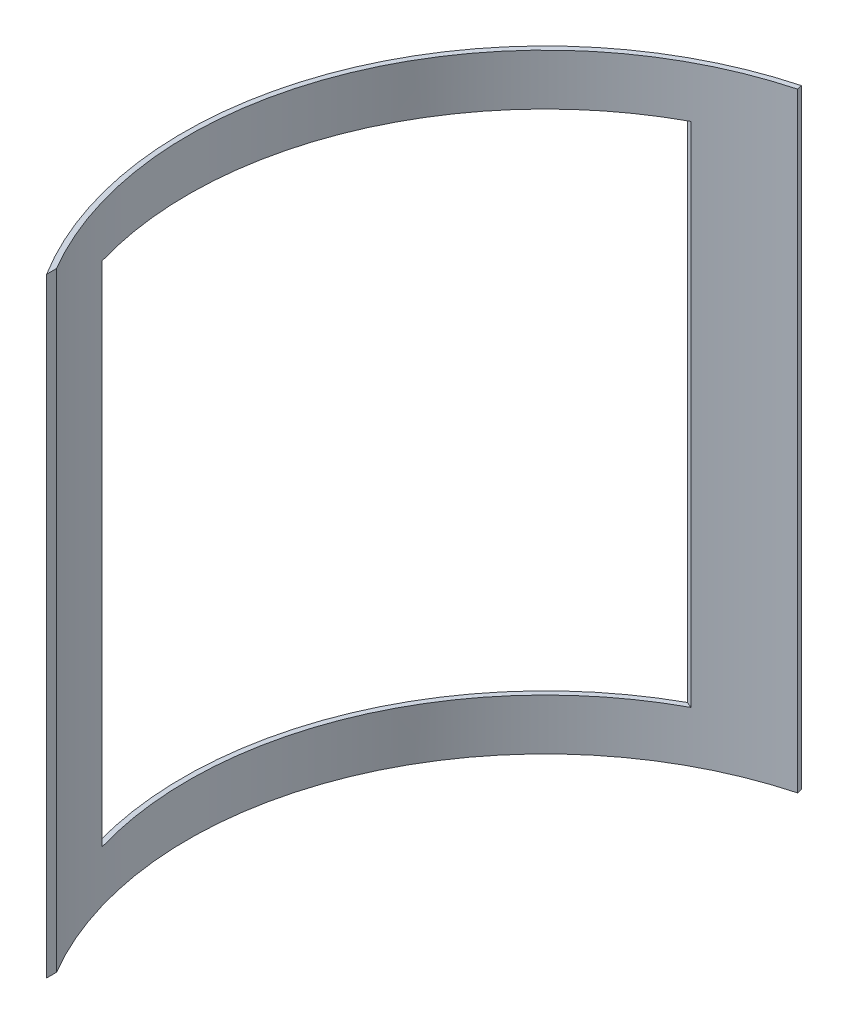
ISO-10303-21;
HEADER;
FILE_DESCRIPTION(('STEP AP214'),'2;1');
FILE_NAME('part.step','',(''),(''),'','','');
FILE_SCHEMA(('AUTOMOTIVE_DESIGN { 1 0 10303 214 1 1 1 1 }'));
ENDSEC;
DATA;
#1=APPLICATION_CONTEXT('core data for automotive mechanical design processes');
#2=APPLICATION_PROTOCOL_DEFINITION('international standard','automotive_design',2000,#1);
#3=PRODUCT_CONTEXT('',#1,'mechanical');
#4=PRODUCT('Part','Part','',(#3));
#5=PRODUCT_RELATED_PRODUCT_CATEGORY('part','',(#4));
#6=PRODUCT_DEFINITION_FORMATION('','',#4);
#7=PRODUCT_DEFINITION_CONTEXT('part definition',#1,'design');
#8=PRODUCT_DEFINITION('design','',#6,#7);
#9=PRODUCT_DEFINITION_SHAPE('','',#8);
#10=(LENGTH_UNIT() NAMED_UNIT(*) SI_UNIT(.MILLI.,.METRE.));
#11=(NAMED_UNIT(*) PLANE_ANGLE_UNIT() SI_UNIT($,.RADIAN.));
#12=(NAMED_UNIT(*) SI_UNIT($,.STERADIAN.) SOLID_ANGLE_UNIT());
#13=UNCERTAINTY_MEASURE_WITH_UNIT(LENGTH_MEASURE(1.E-05),#10,'distance_accuracy_value','');
#14=(GEOMETRIC_REPRESENTATION_CONTEXT(3) GLOBAL_UNCERTAINTY_ASSIGNED_CONTEXT((#13)) GLOBAL_UNIT_ASSIGNED_CONTEXT((#10,
#11,#12)) REPRESENTATION_CONTEXT('',''));
#15=CARTESIAN_POINT('',(0.,0.,0.));
#16=DIRECTION('',(0.,0.,1.));
#17=DIRECTION('',(1.,0.,0.));
#18=AXIS2_PLACEMENT_3D('',#15,#16,#17);
#19=CARTESIAN_POINT('',(-603.303406255924,1995.,-1070.));
#20=DIRECTION('',(1.,0.,0.));
#21=DIRECTION('',(0.,0.,-1.));
#22=AXIS2_PLACEMENT_3D('',#19,#20,#21);
#23=PLANE('',#22);
#24=DIRECTION('',(0.,0.,1.));
#25=VECTOR('',#24,1.);
#26=CARTESIAN_POINT('',(-603.303406255924,800.,-1070.));
#27=LINE('',#26,#25);
#28=CARTESIAN_POINT('',(-603.303406255924,800.,-1070.));
#29=VERTEX_POINT('',#28);
#30=CARTESIAN_POINT('',(-603.303406255924,800.,-1050.6672603151));
#31=VERTEX_POINT('',#30);
#32=EDGE_CURVE('E104',#29,#31,#27,.T.);
#33=ORIENTED_EDGE('',*,*,#32,.F.);
#34=DIRECTION('',(0.,-1.,0.));
#35=VECTOR('',#34,1.);
#36=CARTESIAN_POINT('',(-603.303406255924,1995.,-1070.));
#37=LINE('',#36,#35);
#38=CARTESIAN_POINT('',(-603.303406255924,1995.,-1070.));
#39=VERTEX_POINT('',#38);
#40=EDGE_CURVE('E126',#39,#29,#37,.T.);
#41=ORIENTED_EDGE('',*,*,#40,.F.);
#42=DIRECTION('',(0.,0.,1.));
#43=VECTOR('',#42,1.);
#44=CARTESIAN_POINT('',(-603.303406255924,1995.,-1070.));
#45=LINE('',#44,#43);
#46=CARTESIAN_POINT('',(-603.303406255924,1995.,-1050.6672603151));
#47=VERTEX_POINT('',#46);
#48=EDGE_CURVE('E114',#39,#47,#45,.T.);
#49=ORIENTED_EDGE('',*,*,#48,.T.);
#50=DIRECTION('',(0.,-1.,0.));
#51=VECTOR('',#50,1.);
#52=CARTESIAN_POINT('',(-603.303406255924,1995.,-1050.6672603151));
#53=LINE('',#52,#51);
#54=EDGE_CURVE('E134',#47,#31,#53,.T.);
#55=ORIENTED_EDGE('',*,*,#54,.T.);
#56=EDGE_LOOP('',(#33,#41,#49,#55));
#57=FACE_BOUND('',#56,.T.);
#58=ADVANCED_FACE('F17',(#57),#23,.T.);
#59=CARTESIAN_POINT('',(0.,1995.,-1425.));
#60=DIRECTION('',(0.,-1.,0.));
#61=DIRECTION('',(-0.849723107402709,0.,0.527229210823797));
#62=AXIS2_PLACEMENT_3D('',#59,#60,#61);
#63=CYLINDRICAL_SURFACE('',#62,710.);
#64=DIRECTION('',(0.,-1.,0.));
#65=VECTOR('',#64,1.);
#66=CARTESIAN_POINT('',(-342.982902755816,1995.,-2046.6612650127));
#67=LINE('',#66,#65);
#68=CARTESIAN_POINT('',(-342.982902755816,1895.,-2046.6612650127));
#69=VERTEX_POINT('',#68);
#70=CARTESIAN_POINT('',(-342.982902755816,900.,-2046.6612650127));
#71=VERTEX_POINT('',#70);
#72=EDGE_CURVE('E99',#69,#71,#67,.T.);
#73=ORIENTED_EDGE('',*,*,#72,.F.);
#74=CARTESIAN_POINT('',(0.,1895.,-1425.));
#75=DIRECTION('',(0.,1.,0.));
#76=DIRECTION('',(0.,0.,1.));
#77=AXIS2_PLACEMENT_3D('',#74,#75,#76);
#78=CIRCLE('',#77,710.);
#79=CARTESIAN_POINT('',(-683.189386187943,1895.,-1231.73266546014));
#80=VERTEX_POINT('',#79);
#81=EDGE_CURVE('E97',#80,#69,#78,.F.);
#82=ORIENTED_EDGE('',*,*,#81,.F.);
#83=DIRECTION('',(0.,-1.,0.));
#84=VECTOR('',#83,1.);
#85=CARTESIAN_POINT('',(-683.189386187943,1995.,-1231.73266546014));
#86=LINE('',#85,#84);
#87=CARTESIAN_POINT('',(-683.189386187943,900.,-1231.73266546014));
#88=VERTEX_POINT('',#87);
#89=EDGE_CURVE('E82',#88,#80,#86,.F.);
#90=ORIENTED_EDGE('',*,*,#89,.F.);
#91=CARTESIAN_POINT('',(0.,900.,-1425.));
#92=DIRECTION('',(0.,-1.,0.));
#93=DIRECTION('',(0.,0.,-1.));
#94=AXIS2_PLACEMENT_3D('',#91,#92,#93);
#95=CIRCLE('',#94,710.);
#96=EDGE_CURVE('E77',#71,#88,#95,.F.);
#97=ORIENTED_EDGE('',*,*,#96,.F.);
#98=EDGE_LOOP('',(#73,#82,#90,#97));
#99=FACE_BOUND('',#98,.T.);
#100=CARTESIAN_POINT('',(0.,800.,-1425.));
#101=DIRECTION('',(0.,-1.,0.));
#102=DIRECTION('',(1.,0.,0.));
#103=AXIS2_PLACEMENT_3D('',#100,#101,#102);
#104=CIRCLE('',#103,710.);
#105=CARTESIAN_POINT('',(-183.76152202279,800.,-2110.80733666524));
#106=VERTEX_POINT('',#105);
#107=EDGE_CURVE('E105',#31,#106,#104,.T.);
#108=ORIENTED_EDGE('',*,*,#107,.F.);
#109=ORIENTED_EDGE('',*,*,#54,.F.);
#110=CARTESIAN_POINT('',(0.,1995.,-1425.));
#111=DIRECTION('',(0.,-1.,0.));
#112=DIRECTION('',(1.,0.,0.));
#113=AXIS2_PLACEMENT_3D('',#110,#111,#112);
#114=CIRCLE('',#113,710.);
#115=CARTESIAN_POINT('',(-183.76152202279,1995.,-2110.80733666524));
#116=VERTEX_POINT('',#115);
#117=EDGE_CURVE('E117',#47,#116,#114,.T.);
#118=ORIENTED_EDGE('',*,*,#117,.T.);
#119=DIRECTION('',(0.,-1.,0.));
#120=VECTOR('',#119,1.);
#121=CARTESIAN_POINT('',(-183.76152202279,1995.,-2110.80733666524));
#122=LINE('',#121,#120);
#123=EDGE_CURVE('E132',#116,#106,#122,.T.);
#124=ORIENTED_EDGE('',*,*,#123,.T.);
#125=EDGE_LOOP('',(#108,#109,#118,#124));
#126=FACE_BOUND('',#125,.T.);
#127=ADVANCED_FACE('F95',(#99,#126),#63,.T.);
#128=CARTESIAN_POINT('',(-183.76152202279,1995.,-2110.80733666524));
#129=DIRECTION('',(0.965925826289068,0.,-0.25881904510252));
#130=DIRECTION('',(-0.25881904510252,0.,-0.965925826289069));
#131=AXIS2_PLACEMENT_3D('',#128,#129,#130);
#132=PLANE('',#131);
#133=DIRECTION('',(0.25881904510252,0.,0.965925826289069));
#134=VECTOR('',#133,1.);
#135=CARTESIAN_POINT('',(-183.76152202279,800.,-2110.80733666524));
#136=LINE('',#135,#134);
#137=CARTESIAN_POINT('',(-181.173331571765,800.,-2101.14807840235));
#138=VERTEX_POINT('',#137);
#139=EDGE_CURVE('E108',#106,#138,#136,.T.);
#140=ORIENTED_EDGE('',*,*,#139,.F.);
#141=ORIENTED_EDGE('',*,*,#123,.F.);
#142=DIRECTION('',(0.25881904510252,0.,0.965925826289069));
#143=VECTOR('',#142,1.);
#144=CARTESIAN_POINT('',(-183.76152202279,1995.,-2110.80733666524));
#145=LINE('',#144,#143);
#146=CARTESIAN_POINT('',(-181.173331571765,1995.,-2101.14807840235));
#147=VERTEX_POINT('',#146);
#148=EDGE_CURVE('E120',#116,#147,#145,.T.);
#149=ORIENTED_EDGE('',*,*,#148,.T.);
#150=DIRECTION('',(0.,-1.,0.));
#151=VECTOR('',#150,1.);
#152=CARTESIAN_POINT('',(-181.173331571765,1995.,-2101.14807840235));
#153=LINE('',#152,#151);
#154=EDGE_CURVE('E130',#147,#138,#153,.T.);
#155=ORIENTED_EDGE('',*,*,#154,.T.);
#156=EDGE_LOOP('',(#140,#141,#149,#155));
#157=FACE_BOUND('',#156,.T.);
#158=ADVANCED_FACE('F168',(#157),#132,.T.);
#159=CARTESIAN_POINT('',(0.,1995.,-1425.));
#160=DIRECTION('',(0.,-1.,0.));
#161=DIRECTION('',(-0.849723107402709,0.,0.527229210823797));
#162=AXIS2_PLACEMENT_3D('',#159,#160,#161);
#163=CYLINDRICAL_SURFACE('',#162,700.);
#164=DIRECTION('',(0.,-1.,0.));
#165=VECTOR('',#164,1.);
#166=CARTESIAN_POINT('',(-331.145227409156,1995.,-2041.71941623735));
#167=LINE('',#166,#165);
#168=CARTESIAN_POINT('',(-331.145227409156,900.,-2041.71941623735));
#169=VERTEX_POINT('',#168);
#170=CARTESIAN_POINT('',(-331.145227409156,1895.,-2041.71941623735));
#171=VERTEX_POINT('',#170);
#172=EDGE_CURVE('E11',#169,#171,#167,.F.);
#173=ORIENTED_EDGE('',*,*,#172,.F.);
#174=CARTESIAN_POINT('',(0.,900.,-1425.));
#175=DIRECTION('',(0.,-1.,0.));
#176=DIRECTION('',(0.,0.,-1.));
#177=AXIS2_PLACEMENT_3D('',#174,#175,#176);
#178=CIRCLE('',#177,700.);
#179=CARTESIAN_POINT('',(-671.351710841283,900.,-1226.79081668479));
#180=VERTEX_POINT('',#179);
#181=EDGE_CURVE('E136',#180,#169,#178,.T.);
#182=ORIENTED_EDGE('',*,*,#181,.F.);
#183=DIRECTION('',(0.,-1.,0.));
#184=VECTOR('',#183,1.);
#185=CARTESIAN_POINT('',(-671.351710841283,1995.,-1226.79081668479));
#186=LINE('',#185,#184);
#187=CARTESIAN_POINT('',(-671.351710841283,1895.,-1226.79081668479));
#188=VERTEX_POINT('',#187);
#189=EDGE_CURVE('E90',#188,#180,#186,.T.);
#190=ORIENTED_EDGE('',*,*,#189,.F.);
#191=CARTESIAN_POINT('',(0.,1895.,-1425.));
#192=DIRECTION('',(0.,1.,0.));
#193=DIRECTION('',(0.,0.,1.));
#194=AXIS2_PLACEMENT_3D('',#191,#192,#193);
#195=CIRCLE('',#194,700.);
#196=EDGE_CURVE('E24',#171,#188,#195,.T.);
#197=ORIENTED_EDGE('',*,*,#196,.F.);
#198=EDGE_LOOP('',(#173,#182,#190,#197));
#199=FACE_BOUND('',#198,.T.);
#200=CARTESIAN_POINT('',(0.,800.,-1425.));
#201=DIRECTION('',(0.,1.,0.));
#202=DIRECTION('',(1.,0.,0.));
#203=AXIS2_PLACEMENT_3D('',#200,#201,#202);
#204=CIRCLE('',#203,700.);
#205=EDGE_CURVE('E111',#138,#29,#204,.T.);
#206=ORIENTED_EDGE('',*,*,#205,.F.);
#207=ORIENTED_EDGE('',*,*,#154,.F.);
#208=CARTESIAN_POINT('',(0.,1995.,-1425.));
#209=DIRECTION('',(0.,1.,0.));
#210=DIRECTION('',(1.,0.,0.));
#211=AXIS2_PLACEMENT_3D('',#208,#209,#210);
#212=CIRCLE('',#211,700.);
#213=EDGE_CURVE('E123',#147,#39,#212,.T.);
#214=ORIENTED_EDGE('',*,*,#213,.T.);
#215=ORIENTED_EDGE('',*,*,#40,.T.);
#216=EDGE_LOOP('',(#206,#207,#214,#215));
#217=FACE_BOUND('',#216,.T.);
#218=ADVANCED_FACE('F146',(#199,#217),#163,.F.);
#219=CARTESIAN_POINT('',(0.,1995.,-1425.));
#220=DIRECTION('',(0.,-1.,0.));
#221=DIRECTION('',(-0.849723107402709,0.,0.527229210823797));
#222=AXIS2_PLACEMENT_3D('',#219,#220,#221);
#223=PLANE('',#222);
#224=ORIENTED_EDGE('',*,*,#48,.F.);
#225=ORIENTED_EDGE('',*,*,#213,.F.);
#226=ORIENTED_EDGE('',*,*,#148,.F.);
#227=ORIENTED_EDGE('',*,*,#117,.F.);
#228=EDGE_LOOP('',(#224,#225,#226,#227));
#229=FACE_BOUND('',#228,.T.);
#230=ADVANCED_FACE('F160',(#229),#223,.F.);
#231=CARTESIAN_POINT('',(0.,800.,-1425.));
#232=DIRECTION('',(0.,-1.,0.));
#233=DIRECTION('',(-0.849723107402709,0.,0.527229210823797));
#234=AXIS2_PLACEMENT_3D('',#231,#232,#233);
#235=PLANE('',#234);
#236=ORIENTED_EDGE('',*,*,#32,.T.);
#237=ORIENTED_EDGE('',*,*,#107,.T.);
#238=ORIENTED_EDGE('',*,*,#139,.T.);
#239=ORIENTED_EDGE('',*,*,#205,.T.);
#240=EDGE_LOOP('',(#236,#237,#238,#239));
#241=FACE_BOUND('',#240,.T.);
#242=ADVANCED_FACE('F152',(#241),#235,.T.);
#243=CARTESIAN_POINT('',(-1979.82462925009,900.,-2729.99004745001));
#244=DIRECTION('',(0.38524526141638,0.,-0.92281422212503));
#245=DIRECTION('',(0.,-1.,0.));
#246=AXIS2_PLACEMENT_3D('',#243,#244,#245);
#247=PLANE('',#246);
#248=ORIENTED_EDGE('',*,*,#72,.T.);
#249=DIRECTION('',(0.922814222125031,0.,0.38524526141638));
#250=VECTOR('',#249,1.);
#251=CARTESIAN_POINT('',(-1979.82462925009,900.,-2729.99004745001));
#252=LINE('',#251,#250);
#253=EDGE_CURVE('E31',#71,#169,#252,.T.);
#254=ORIENTED_EDGE('',*,*,#253,.T.);
#255=ORIENTED_EDGE('',*,*,#172,.T.);
#256=DIRECTION('',(0.922814222125031,0.,0.38524526141638));
#257=VECTOR('',#256,1.);
#258=CARTESIAN_POINT('',(-1979.82462925009,1895.,-2729.99004745001));
#259=LINE('',#258,#257);
#260=EDGE_CURVE('E83',#69,#171,#259,.T.);
#261=ORIENTED_EDGE('',*,*,#260,.F.);
#262=EDGE_LOOP('',(#248,#254,#255,#261));
#263=FACE_BOUND('',#262,.T.);
#264=ADVANCED_FACE('F149',(#263),#247,.F.);
#265=CARTESIAN_POINT('',(-1979.82462925009,1895.,-2729.99004745001));
#266=DIRECTION('',(0.,1.,0.));
#267=DIRECTION('',(0.38524526141638,0.,-0.92281422212503));
#268=AXIS2_PLACEMENT_3D('',#265,#266,#267);
#269=PLANE('',#268);
#270=ORIENTED_EDGE('',*,*,#81,.T.);
#271=ORIENTED_EDGE('',*,*,#260,.T.);
#272=ORIENTED_EDGE('',*,*,#196,.T.);
#273=DIRECTION('',(0.922814222125031,0.,0.38524526141638));
#274=VECTOR('',#273,1.);
#275=CARTESIAN_POINT('',(-2320.03111268221,1895.,-1915.06144789745));
#276=LINE('',#275,#274);
#277=EDGE_CURVE('E92',#80,#188,#276,.T.);
#278=ORIENTED_EDGE('',*,*,#277,.F.);
#279=EDGE_LOOP('',(#270,#271,#272,#278));
#280=FACE_BOUND('',#279,.T.);
#281=ADVANCED_FACE('F141',(#280),#269,.F.);
#282=CARTESIAN_POINT('',(-2320.03111268221,1895.,-1915.06144789745));
#283=DIRECTION('',(-0.38524526141638,0.,0.92281422212503));
#284=DIRECTION('',(0.,1.,0.));
#285=AXIS2_PLACEMENT_3D('',#282,#283,#284);
#286=PLANE('',#285);
#287=ORIENTED_EDGE('',*,*,#89,.T.);
#288=ORIENTED_EDGE('',*,*,#277,.T.);
#289=ORIENTED_EDGE('',*,*,#189,.T.);
#290=DIRECTION('',(0.922814222125031,0.,0.38524526141638));
#291=VECTOR('',#290,1.);
#292=CARTESIAN_POINT('',(-2320.03111268221,900.,-1915.06144789745));
#293=LINE('',#292,#291);
#294=EDGE_CURVE('E36',#88,#180,#293,.T.);
#295=ORIENTED_EDGE('',*,*,#294,.F.);
#296=EDGE_LOOP('',(#287,#288,#289,#295));
#297=FACE_BOUND('',#296,.T.);
#298=ADVANCED_FACE('F86',(#297),#286,.F.);
#299=CARTESIAN_POINT('',(-2320.03111268221,900.,-1915.06144789745));
#300=DIRECTION('',(0.,-1.,0.));
#301=DIRECTION('',(-0.38524526141638,0.,0.92281422212503));
#302=AXIS2_PLACEMENT_3D('',#299,#300,#301);
#303=PLANE('',#302);
#304=ORIENTED_EDGE('',*,*,#96,.T.);
#305=ORIENTED_EDGE('',*,*,#294,.T.);
#306=ORIENTED_EDGE('',*,*,#181,.T.);
#307=ORIENTED_EDGE('',*,*,#253,.F.);
#308=EDGE_LOOP('',(#304,#305,#306,#307));
#309=FACE_BOUND('',#308,.T.);
#310=ADVANCED_FACE('F78',(#309),#303,.F.);
#311=CLOSED_SHELL('',(#58,#127,#158,#218,#230,#242,#264,#281,#298,#310));
#312=MANIFOLD_SOLID_BREP('B1',#311);
#313=ADVANCED_BREP_SHAPE_REPRESENTATION('',(#18,#312),#14);
#314=SHAPE_DEFINITION_REPRESENTATION(#9,#313);
ENDSEC;
END-ISO-10303-21;
